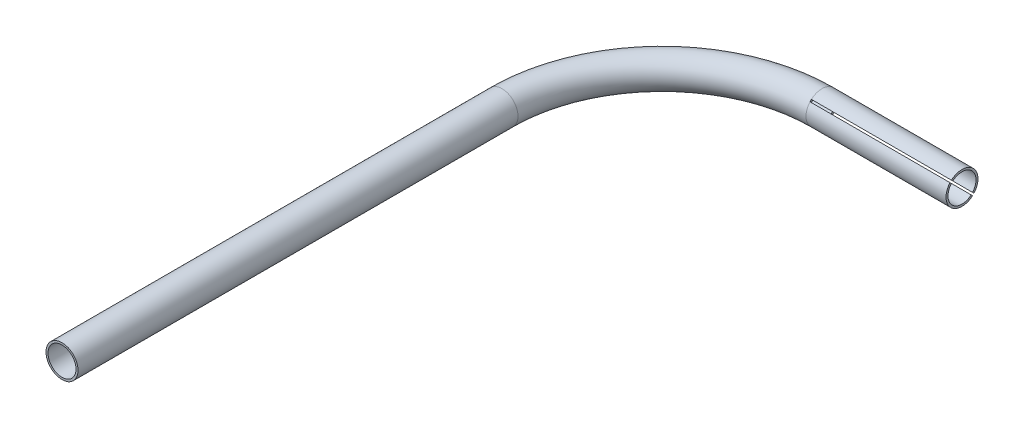
ISO-10303-21;
HEADER;
FILE_DESCRIPTION(('STEP AP214'),'2;1');
FILE_NAME('part.step','',(''),(''),'','','');
FILE_SCHEMA(('AUTOMOTIVE_DESIGN { 1 0 10303 214 1 1 1 1 }'));
ENDSEC;
DATA;
#1=APPLICATION_CONTEXT('core data for automotive mechanical design processes');
#2=APPLICATION_PROTOCOL_DEFINITION('international standard','automotive_design',2000,#1);
#3=PRODUCT_CONTEXT('',#1,'mechanical');
#4=PRODUCT('Part','Part','',(#3));
#5=PRODUCT_RELATED_PRODUCT_CATEGORY('part','',(#4));
#6=PRODUCT_DEFINITION_FORMATION('','',#4);
#7=PRODUCT_DEFINITION_CONTEXT('part definition',#1,'design');
#8=PRODUCT_DEFINITION('design','',#6,#7);
#9=PRODUCT_DEFINITION_SHAPE('','',#8);
#10=(LENGTH_UNIT() NAMED_UNIT(*) SI_UNIT(.MILLI.,.METRE.));
#11=(NAMED_UNIT(*) PLANE_ANGLE_UNIT() SI_UNIT($,.RADIAN.));
#12=(NAMED_UNIT(*) SI_UNIT($,.STERADIAN.) SOLID_ANGLE_UNIT());
#13=UNCERTAINTY_MEASURE_WITH_UNIT(LENGTH_MEASURE(1.E-05),#10,'distance_accuracy_value','');
#14=(GEOMETRIC_REPRESENTATION_CONTEXT(3) GLOBAL_UNCERTAINTY_ASSIGNED_CONTEXT((#13)) GLOBAL_UNIT_ASSIGNED_CONTEXT((#10,
#11,#12)) REPRESENTATION_CONTEXT('',''));
#15=CARTESIAN_POINT('',(0.,0.,0.));
#16=DIRECTION('',(0.,0.,1.));
#17=DIRECTION('',(1.,0.,0.));
#18=AXIS2_PLACEMENT_3D('',#15,#16,#17);
#19=CARTESIAN_POINT('',(0.,0.,0.));
#20=DIRECTION('',(-1.,0.,0.));
#21=DIRECTION('',(0.,0.,1.));
#22=AXIS2_PLACEMENT_3D('',#19,#20,#21);
#23=CYLINDRICAL_SURFACE('',#22,8.);
#24=CARTESIAN_POINT('',(0.,0.,0.));
#25=DIRECTION('',(1.,0.,0.));
#26=DIRECTION('',(0.,0.,-1.));
#27=AXIS2_PLACEMENT_3D('',#24,#25,#26);
#28=CIRCLE('',#27,8.);
#29=CARTESIAN_POINT('',(0.,5.29224150472479,5.99934828591142));
#30=VERTEX_POINT('',#29);
#31=CARTESIAN_POINT('',(0.,-5.99934828591134,-5.29224150472487));
#32=VERTEX_POINT('',#31);
#33=EDGE_CURVE('E134',#30,#32,#28,.T.);
#34=ORIENTED_EDGE('',*,*,#33,.F.);
#35=DIRECTION('',(-1.,0.,0.));
#36=VECTOR('',#35,1.);
#37=CARTESIAN_POINT('',(0.,5.29224150472479,5.99934828591142));
#38=LINE('',#37,#36);
#39=CARTESIAN_POINT('',(-70.,5.2922415047248,5.99934828591142));
#40=VERTEX_POINT('',#39);
#41=EDGE_CURVE('E120',#30,#40,#38,.T.);
#42=ORIENTED_EDGE('',*,*,#41,.T.);
#43=CARTESIAN_POINT('',(-70.,0.,0.));
#44=DIRECTION('',(1.,0.,0.));
#45=DIRECTION('',(0.,0.,-1.));
#46=AXIS2_PLACEMENT_3D('',#43,#44,#45);
#47=CIRCLE('',#46,8.);
#48=CARTESIAN_POINT('',(-70.,-5.99934828591134,-5.29224150472487));
#49=VERTEX_POINT('',#48);
#50=EDGE_CURVE('E115',#40,#49,#47,.T.);
#51=ORIENTED_EDGE('',*,*,#50,.T.);
#52=DIRECTION('',(-1.,0.,0.));
#53=VECTOR('',#52,1.);
#54=CARTESIAN_POINT('',(0.,-5.99934828591134,-5.29224150472487));
#55=LINE('',#54,#53);
#56=EDGE_CURVE('E136',#49,#32,#55,.F.);
#57=ORIENTED_EDGE('',*,*,#56,.T.);
#58=EDGE_LOOP('',(#34,#42,#51,#57));
#59=FACE_BOUND('',#58,.T.);
#60=ADVANCED_FACE('F39',(#59),#23,.T.);
#61=CARTESIAN_POINT('',(0.,0.,0.));
#62=DIRECTION('',(1.,0.,0.));
#63=DIRECTION('',(0.,0.,-1.));
#64=AXIS2_PLACEMENT_3D('',#61,#62,#63);
#65=PLANE('',#64);
#66=DIRECTION('',(0.,-0.707106781186543,-0.707106781186552));
#67=VECTOR('',#66,1.);
#68=CARTESIAN_POINT('',(0.,-6.01040764008563,-5.30330085889916));
#69=LINE('',#68,#67);
#70=CARTESIAN_POINT('',(0.,4.58355102393957,5.29065780512618));
#71=VERTEX_POINT('',#70);
#72=EDGE_CURVE('E193',#30,#71,#69,.T.);
#73=ORIENTED_EDGE('',*,*,#72,.F.);
#74=ORIENTED_EDGE('',*,*,#33,.T.);
#75=CARTESIAN_POINT('',(0.,-5.29065780512612,-4.58355102393964));
#76=VERTEX_POINT('',#75);
#77=EDGE_CURVE('E190',#76,#32,#69,.T.);
#78=ORIENTED_EDGE('',*,*,#77,.F.);
#79=CARTESIAN_POINT('',(0.,0.,0.));
#80=DIRECTION('',(1.,0.,0.));
#81=DIRECTION('',(0.,0.,-1.));
#82=AXIS2_PLACEMENT_3D('',#79,#80,#81);
#83=CIRCLE('',#82,7.);
#84=EDGE_CURVE('E162',#76,#71,#83,.F.);
#85=ORIENTED_EDGE('',*,*,#84,.T.);
#86=EDGE_LOOP('',(#73,#74,#78,#85));
#87=FACE_BOUND('',#86,.T.);
#88=ADVANCED_FACE('F211',(#87),#65,.T.);
#89=CARTESIAN_POINT('',(0.,0.,0.));
#90=DIRECTION('',(-1.,0.,0.));
#91=DIRECTION('',(0.,0.,1.));
#92=AXIS2_PLACEMENT_3D('',#89,#90,#91);
#93=CYLINDRICAL_SURFACE('',#92,7.);
#94=CARTESIAN_POINT('',(-70.,0.,0.));
#95=DIRECTION('',(1.,0.,0.));
#96=DIRECTION('',(0.,0.,-1.));
#97=AXIS2_PLACEMENT_3D('',#94,#95,#96);
#98=CIRCLE('',#97,7.);
#99=CARTESIAN_POINT('',(-70.,-5.29065780512611,-4.58355102393963));
#100=VERTEX_POINT('',#99);
#101=CARTESIAN_POINT('',(-70.,4.58355102393957,5.29065780512619));
#102=VERTEX_POINT('',#101);
#103=EDGE_CURVE('E158',#100,#102,#98,.F.);
#104=ORIENTED_EDGE('',*,*,#103,.T.);
#105=DIRECTION('',(-1.,0.,0.));
#106=VECTOR('',#105,1.);
#107=CARTESIAN_POINT('',(0.,4.58355102393956,5.29065780512618));
#108=LINE('',#107,#106);
#109=EDGE_CURVE('E123',#102,#71,#108,.F.);
#110=ORIENTED_EDGE('',*,*,#109,.T.);
#111=ORIENTED_EDGE('',*,*,#84,.F.);
#112=DIRECTION('',(-1.,0.,0.));
#113=VECTOR('',#112,1.);
#114=CARTESIAN_POINT('',(0.,-5.29065780512612,-4.58355102393964));
#115=LINE('',#114,#113);
#116=EDGE_CURVE('E168',#76,#100,#115,.T.);
#117=ORIENTED_EDGE('',*,*,#116,.T.);
#118=EDGE_LOOP('',(#104,#110,#111,#117));
#119=FACE_BOUND('',#118,.T.);
#120=ADVANCED_FACE('F208',(#119),#93,.F.);
#121=CARTESIAN_POINT('',(0.,-5.29224150472479,-5.99934828591142));
#122=VERTEX_POINT('',#121);
#123=CARTESIAN_POINT('',(0.,5.99934828591134,5.29224150472487));
#124=VERTEX_POINT('',#123);
#125=EDGE_CURVE('E143',#122,#124,#28,.T.);
#126=ORIENTED_EDGE('',*,*,#125,.F.);
#127=DIRECTION('',(-1.,0.,0.));
#128=VECTOR('',#127,1.);
#129=CARTESIAN_POINT('',(0.,-5.29224150472479,-5.99934828591142));
#130=LINE('',#129,#128);
#131=CARTESIAN_POINT('',(-70.,-5.29224150472479,-5.99934828591141));
#132=VERTEX_POINT('',#131);
#133=EDGE_CURVE('E172',#122,#132,#130,.T.);
#134=ORIENTED_EDGE('',*,*,#133,.T.);
#135=CARTESIAN_POINT('',(-70.,5.99934828591135,5.29224150472488));
#136=VERTEX_POINT('',#135);
#137=EDGE_CURVE('E116',#132,#136,#47,.T.);
#138=ORIENTED_EDGE('',*,*,#137,.T.);
#139=DIRECTION('',(-1.,0.,0.));
#140=VECTOR('',#139,1.);
#141=CARTESIAN_POINT('',(0.,5.99934828591134,5.29224150472487));
#142=LINE('',#141,#140);
#143=EDGE_CURVE('E176',#136,#124,#142,.F.);
#144=ORIENTED_EDGE('',*,*,#143,.T.);
#145=EDGE_LOOP('',(#126,#134,#138,#144));
#146=FACE_BOUND('',#145,.T.);
#147=ADVANCED_FACE('F248',(#146),#23,.T.);
#148=CARTESIAN_POINT('',(-70.,0.,80.));
#149=DIRECTION('',(0.,1.,0.));
#150=DIRECTION('',(0.,0.,1.));
#151=AXIS2_PLACEMENT_3D('',#148,#149,#150);
#152=TOROIDAL_SURFACE('',#151,80.,8.);
#153=CARTESIAN_POINT('',(-150.,0.,80.));
#154=DIRECTION('',(0.,0.,-1.));
#155=DIRECTION('',(-1.,0.,0.));
#156=AXIS2_PLACEMENT_3D('',#153,#154,#155);
#157=CIRCLE('',#156,8.);
#158=CARTESIAN_POINT('',(-158.,0.,80.));
#159=VERTEX_POINT('',#158);
#160=EDGE_CURVE('E43',#159,#159,#157,.T.);
#161=ORIENTED_EDGE('',*,*,#160,.T.);
#162=EDGE_LOOP('',(#161));
#163=FACE_BOUND('',#162,.T.);
#164=EDGE_CURVE('E106',#136,#40,#47,.T.);
#165=ORIENTED_EDGE('',*,*,#164,.F.);
#166=ORIENTED_EDGE('',*,*,#137,.F.);
#167=CARTESIAN_POINT('',(-70.,0.,0.));
#168=DIRECTION('',(1.,0.,0.));
#169=DIRECTION('',(0.,0.,-1.));
#170=AXIS2_PLACEMENT_3D('',#167,#168,#169);
#171=CIRCLE('',#170,8.);
#172=EDGE_CURVE('E126',#49,#132,#171,.T.);
#173=ORIENTED_EDGE('',*,*,#172,.F.);
#174=ORIENTED_EDGE('',*,*,#50,.F.);
#175=EDGE_LOOP('',(#165,#166,#173,#174));
#176=FACE_BOUND('',#175,.T.);
#177=ADVANCED_FACE('F139',(#163,#176),#152,.T.);
#178=CARTESIAN_POINT('',(-150.,0.,80.));
#179=DIRECTION('',(0.,0.,1.));
#180=DIRECTION('',(1.,0.,0.));
#181=AXIS2_PLACEMENT_3D('',#178,#179,#180);
#182=CYLINDRICAL_SURFACE('',#181,8.);
#183=CARTESIAN_POINT('',(-150.,0.,300.));
#184=DIRECTION('',(0.,0.,-1.));
#185=DIRECTION('',(-1.,0.,0.));
#186=AXIS2_PLACEMENT_3D('',#183,#184,#185);
#187=CIRCLE('',#186,8.);
#188=CARTESIAN_POINT('',(-158.,0.,300.));
#189=VERTEX_POINT('',#188);
#190=EDGE_CURVE('E147',#189,#189,#187,.T.);
#191=ORIENTED_EDGE('',*,*,#190,.T.);
#192=EDGE_LOOP('',(#191));
#193=FACE_BOUND('',#192,.T.);
#194=ORIENTED_EDGE('',*,*,#160,.F.);
#195=EDGE_LOOP('',(#194));
#196=FACE_BOUND('',#195,.T.);
#197=ADVANCED_FACE('F41',(#193,#196),#182,.T.);
#198=DIRECTION('',(0.,0.707106781186543,0.707106781186552));
#199=VECTOR('',#198,1.);
#200=CARTESIAN_POINT('',(0.,-5.30330085889908,-6.01040764008571));
#201=LINE('',#200,#199);
#202=CARTESIAN_POINT('',(0.,-4.58355102393957,-5.29065780512618));
#203=VERTEX_POINT('',#202);
#204=EDGE_CURVE('E194',#122,#203,#201,.T.);
#205=ORIENTED_EDGE('',*,*,#204,.F.);
#206=ORIENTED_EDGE('',*,*,#125,.T.);
#207=CARTESIAN_POINT('',(0.,5.29065780512612,4.58355102393964));
#208=VERTEX_POINT('',#207);
#209=EDGE_CURVE('E195',#208,#124,#201,.T.);
#210=ORIENTED_EDGE('',*,*,#209,.F.);
#211=EDGE_CURVE('E150',#208,#203,#83,.F.);
#212=ORIENTED_EDGE('',*,*,#211,.T.);
#213=EDGE_LOOP('',(#205,#206,#210,#212));
#214=FACE_BOUND('',#213,.T.);
#215=ADVANCED_FACE('F239',(#214),#65,.T.);
#216=CARTESIAN_POINT('',(-150.,0.,300.));
#217=DIRECTION('',(0.,0.,-1.));
#218=DIRECTION('',(-1.,0.,0.));
#219=AXIS2_PLACEMENT_3D('',#216,#217,#218);
#220=PLANE('',#219);
#221=CARTESIAN_POINT('',(-150.,0.,300.));
#222=DIRECTION('',(0.,0.,-1.));
#223=DIRECTION('',(-1.,0.,0.));
#224=AXIS2_PLACEMENT_3D('',#221,#222,#223);
#225=CIRCLE('',#224,7.);
#226=CARTESIAN_POINT('',(-157.,0.,300.));
#227=VERTEX_POINT('',#226);
#228=EDGE_CURVE('E11',#227,#227,#225,.F.);
#229=ORIENTED_EDGE('',*,*,#228,.F.);
#230=EDGE_LOOP('',(#229));
#231=FACE_BOUND('',#230,.T.);
#232=ORIENTED_EDGE('',*,*,#190,.F.);
#233=EDGE_LOOP('',(#232));
#234=FACE_BOUND('',#233,.T.);
#235=ADVANCED_FACE('F245',(#231,#234),#220,.F.);
#236=CARTESIAN_POINT('',(-70.,5.29065780512612,4.58355102393965));
#237=VERTEX_POINT('',#236);
#238=CARTESIAN_POINT('',(-70.,-4.58355102393956,-5.29065780512617));
#239=VERTEX_POINT('',#238);
#240=EDGE_CURVE('E159',#237,#239,#98,.F.);
#241=ORIENTED_EDGE('',*,*,#240,.T.);
#242=DIRECTION('',(-1.,0.,0.));
#243=VECTOR('',#242,1.);
#244=CARTESIAN_POINT('',(0.,-4.58355102393957,-5.29065780512618));
#245=LINE('',#244,#243);
#246=EDGE_CURVE('E180',#239,#203,#245,.F.);
#247=ORIENTED_EDGE('',*,*,#246,.T.);
#248=ORIENTED_EDGE('',*,*,#211,.F.);
#249=DIRECTION('',(-1.,0.,0.));
#250=VECTOR('',#249,1.);
#251=CARTESIAN_POINT('',(0.,5.29065780512612,4.58355102393964));
#252=LINE('',#251,#250);
#253=EDGE_CURVE('E184',#208,#237,#252,.T.);
#254=ORIENTED_EDGE('',*,*,#253,.T.);
#255=EDGE_LOOP('',(#241,#247,#248,#254));
#256=FACE_BOUND('',#255,.T.);
#257=ADVANCED_FACE('F226',(#256),#93,.F.);
#258=CARTESIAN_POINT('',(-70.,0.,80.));
#259=DIRECTION('',(0.,1.,0.));
#260=DIRECTION('',(0.,0.,1.));
#261=AXIS2_PLACEMENT_3D('',#258,#259,#260);
#262=TOROIDAL_SURFACE('',#261,80.,7.);
#263=CARTESIAN_POINT('',(-150.,0.,80.));
#264=DIRECTION('',(0.,0.,-1.));
#265=DIRECTION('',(-1.,0.,0.));
#266=AXIS2_PLACEMENT_3D('',#263,#264,#265);
#267=CIRCLE('',#266,7.);
#268=CARTESIAN_POINT('',(-157.,0.,80.));
#269=VERTEX_POINT('',#268);
#270=EDGE_CURVE('E49',#269,#269,#267,.F.);
#271=ORIENTED_EDGE('',*,*,#270,.T.);
#272=EDGE_LOOP('',(#271));
#273=FACE_BOUND('',#272,.T.);
#274=EDGE_CURVE('E155',#239,#100,#98,.F.);
#275=ORIENTED_EDGE('',*,*,#274,.F.);
#276=ORIENTED_EDGE('',*,*,#240,.F.);
#277=EDGE_CURVE('E215',#102,#237,#98,.F.);
#278=ORIENTED_EDGE('',*,*,#277,.F.);
#279=ORIENTED_EDGE('',*,*,#103,.F.);
#280=EDGE_LOOP('',(#275,#276,#278,#279));
#281=FACE_BOUND('',#280,.T.);
#282=ADVANCED_FACE('F227',(#273,#281),#262,.F.);
#283=CARTESIAN_POINT('',(-150.,0.,80.));
#284=DIRECTION('',(0.,0.,1.));
#285=DIRECTION('',(1.,0.,0.));
#286=AXIS2_PLACEMENT_3D('',#283,#284,#285);
#287=CYLINDRICAL_SURFACE('',#286,7.);
#288=ORIENTED_EDGE('',*,*,#228,.T.);
#289=EDGE_LOOP('',(#288));
#290=FACE_BOUND('',#289,.T.);
#291=ORIENTED_EDGE('',*,*,#270,.F.);
#292=EDGE_LOOP('',(#291));
#293=FACE_BOUND('',#292,.T.);
#294=ADVANCED_FACE('F260',(#290,#293),#287,.F.);
#295=CARTESIAN_POINT('',(-70.,0.,0.));
#296=DIRECTION('',(1.,0.,0.));
#297=DIRECTION('',(0.,0.,-1.));
#298=AXIS2_PLACEMENT_3D('',#295,#296,#297);
#299=PLANE('',#298);
#300=ORIENTED_EDGE('',*,*,#164,.T.);
#301=DIRECTION('',(0.,-0.707106781186543,-0.707106781186552));
#302=VECTOR('',#301,1.);
#303=CARTESIAN_POINT('',(-70.,-6.01040764008563,-5.30330085889916));
#304=LINE('',#303,#302);
#305=EDGE_CURVE('E57',#40,#102,#304,.T.);
#306=ORIENTED_EDGE('',*,*,#305,.T.);
#307=ORIENTED_EDGE('',*,*,#277,.T.);
#308=DIRECTION('',(0.,0.707106781186543,0.707106781186552));
#309=VECTOR('',#308,1.);
#310=CARTESIAN_POINT('',(-70.,-5.30330085889908,-6.01040764008571));
#311=LINE('',#310,#309);
#312=EDGE_CURVE('E109',#237,#136,#311,.T.);
#313=ORIENTED_EDGE('',*,*,#312,.T.);
#314=EDGE_LOOP('',(#300,#306,#307,#313));
#315=FACE_BOUND('',#314,.T.);
#316=ADVANCED_FACE('F107',(#315),#299,.T.);
#317=CARTESIAN_POINT('',(-70.,-5.30330085889908,-6.01040764008571));
#318=DIRECTION('',(0.,0.707106781186552,-0.707106781186543));
#319=DIRECTION('',(0.,0.707106781186543,0.707106781186552));
#320=AXIS2_PLACEMENT_3D('',#317,#318,#319);
#321=PLANE('',#320);
#322=ORIENTED_EDGE('',*,*,#312,.F.);
#323=ORIENTED_EDGE('',*,*,#253,.F.);
#324=ORIENTED_EDGE('',*,*,#209,.T.);
#325=ORIENTED_EDGE('',*,*,#143,.F.);
#326=EDGE_LOOP('',(#322,#323,#324,#325));
#327=FACE_BOUND('',#326,.T.);
#328=ADVANCED_FACE('F223',(#327),#321,.F.);
#329=CARTESIAN_POINT('',(-70.,-6.01040764008563,-5.30330085889916));
#330=DIRECTION('',(0.,-0.707106781186552,0.707106781186543));
#331=DIRECTION('',(0.,-0.707106781186543,-0.707106781186552));
#332=AXIS2_PLACEMENT_3D('',#329,#330,#331);
#333=PLANE('',#332);
#334=ORIENTED_EDGE('',*,*,#72,.T.);
#335=ORIENTED_EDGE('',*,*,#109,.F.);
#336=ORIENTED_EDGE('',*,*,#305,.F.);
#337=ORIENTED_EDGE('',*,*,#41,.F.);
#338=EDGE_LOOP('',(#334,#335,#336,#337));
#339=FACE_BOUND('',#338,.T.);
#340=ADVANCED_FACE('F119',(#339),#333,.F.);
#341=EDGE_CURVE('E127',#100,#49,#304,.T.);
#342=ORIENTED_EDGE('',*,*,#341,.F.);
#343=ORIENTED_EDGE('',*,*,#116,.F.);
#344=ORIENTED_EDGE('',*,*,#77,.T.);
#345=ORIENTED_EDGE('',*,*,#56,.F.);
#346=EDGE_LOOP('',(#342,#343,#344,#345));
#347=FACE_BOUND('',#346,.T.);
#348=ADVANCED_FACE('F231',(#347),#333,.F.);
#349=ORIENTED_EDGE('',*,*,#204,.T.);
#350=ORIENTED_EDGE('',*,*,#246,.F.);
#351=EDGE_CURVE('E65',#132,#239,#311,.T.);
#352=ORIENTED_EDGE('',*,*,#351,.F.);
#353=ORIENTED_EDGE('',*,*,#133,.F.);
#354=EDGE_LOOP('',(#349,#350,#352,#353));
#355=FACE_BOUND('',#354,.T.);
#356=ADVANCED_FACE('F269',(#355),#321,.F.);
#357=ORIENTED_EDGE('',*,*,#172,.T.);
#358=ORIENTED_EDGE('',*,*,#351,.T.);
#359=ORIENTED_EDGE('',*,*,#274,.T.);
#360=ORIENTED_EDGE('',*,*,#341,.T.);
#361=EDGE_LOOP('',(#357,#358,#359,#360));
#362=FACE_BOUND('',#361,.T.);
#363=ADVANCED_FACE('F229',(#362),#299,.T.);
#364=CLOSED_SHELL('',(#60,#88,#120,#147,#177,#197,#215,#235,#257,#282,#294,#316,#328,#340,#348,
#356,#363));
#365=MANIFOLD_SOLID_BREP('B2',#364);
#366=ADVANCED_BREP_SHAPE_REPRESENTATION('',(#18,#365),#14);
#367=SHAPE_DEFINITION_REPRESENTATION(#9,#366);
ENDSEC;
END-ISO-10303-21;
